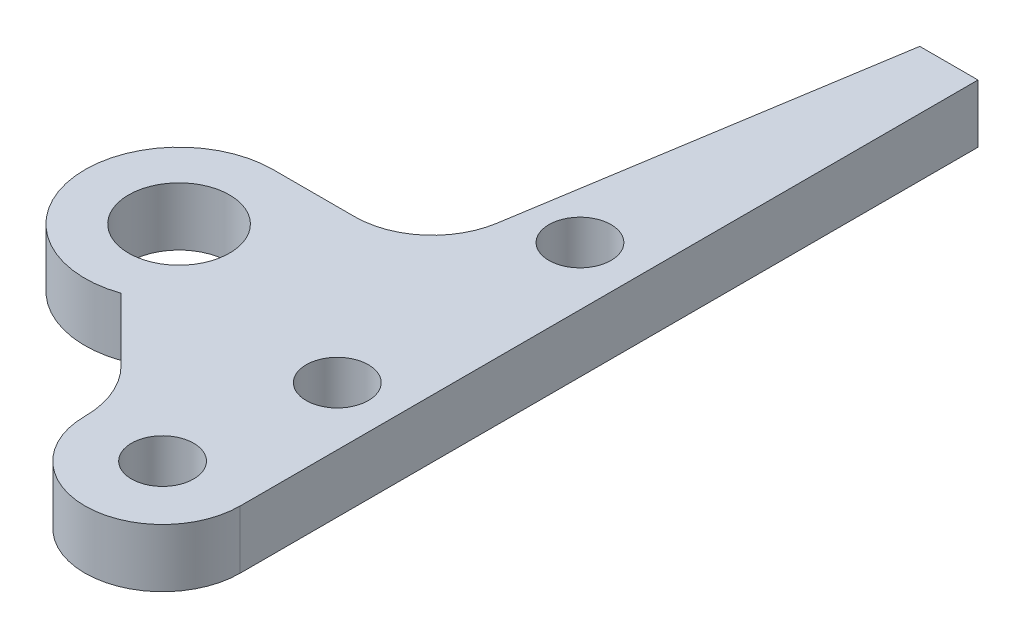
ISO-10303-21;
HEADER;
FILE_DESCRIPTION(('STEP AP214'),'2;1');
FILE_NAME('part.step','',(''),(''),'','','');
FILE_SCHEMA(('AUTOMOTIVE_DESIGN { 1 0 10303 214 1 1 1 1 }'));
ENDSEC;
DATA;
#1=APPLICATION_CONTEXT('core data for automotive mechanical design processes');
#2=APPLICATION_PROTOCOL_DEFINITION('international standard','automotive_design',2000,#1);
#3=PRODUCT_CONTEXT('',#1,'mechanical');
#4=PRODUCT('Part','Part','',(#3));
#5=PRODUCT_RELATED_PRODUCT_CATEGORY('part','',(#4));
#6=PRODUCT_DEFINITION_FORMATION('','',#4);
#7=PRODUCT_DEFINITION_CONTEXT('part definition',#1,'design');
#8=PRODUCT_DEFINITION('design','',#6,#7);
#9=PRODUCT_DEFINITION_SHAPE('','',#8);
#10=(LENGTH_UNIT() NAMED_UNIT(*) SI_UNIT(.MILLI.,.METRE.));
#11=(NAMED_UNIT(*) PLANE_ANGLE_UNIT() SI_UNIT($,.RADIAN.));
#12=(NAMED_UNIT(*) SI_UNIT($,.STERADIAN.) SOLID_ANGLE_UNIT());
#13=UNCERTAINTY_MEASURE_WITH_UNIT(LENGTH_MEASURE(1.E-05),#10,'distance_accuracy_value','');
#14=(GEOMETRIC_REPRESENTATION_CONTEXT(3) GLOBAL_UNCERTAINTY_ASSIGNED_CONTEXT((#13)) GLOBAL_UNIT_ASSIGNED_CONTEXT((#10,
#11,#12)) REPRESENTATION_CONTEXT('',''));
#15=CARTESIAN_POINT('',(0.,0.,0.));
#16=DIRECTION('',(0.,0.,1.));
#17=DIRECTION('',(1.,0.,0.));
#18=AXIS2_PLACEMENT_3D('',#15,#16,#17);
#19=CARTESIAN_POINT('',(0.,0.,0.));
#20=DIRECTION('',(0.,1.,0.));
#21=DIRECTION('',(1.,0.,0.));
#22=AXIS2_PLACEMENT_3D('',#19,#20,#21);
#23=PLANE('',#22);
#24=DIRECTION('',(-0.157736652180697,0.,0.98748121428148));
#25=VECTOR('',#24,1.);
#26=CARTESIAN_POINT('',(11.15,0.,-27.));
#27=LINE('',#26,#25);
#28=CARTESIAN_POINT('',(11.15,0.,-27.));
#29=VERTEX_POINT('',#28);
#30=CARTESIAN_POINT('',(8.15,0.,-8.219053391277));
#31=VERTEX_POINT('',#30);
#32=EDGE_CURVE('E111',#29,#31,#27,.T.);
#33=ORIENTED_EDGE('',*,*,#32,.F.);
#34=DIRECTION('',(-1.,0.,0.));
#35=VECTOR('',#34,1.);
#36=CARTESIAN_POINT('',(14.15,0.,-27.));
#37=LINE('',#36,#35);
#38=CARTESIAN_POINT('',(14.15,0.,-27.));
#39=VERTEX_POINT('',#38);
#40=EDGE_CURVE('E36',#39,#29,#37,.T.);
#41=ORIENTED_EDGE('',*,*,#40,.F.);
#42=DIRECTION('',(0.,0.,-1.));
#43=VECTOR('',#42,1.);
#44=CARTESIAN_POINT('',(14.15,0.,11.));
#45=LINE('',#44,#43);
#46=CARTESIAN_POINT('',(14.15,0.,11.));
#47=VERTEX_POINT('',#46);
#48=EDGE_CURVE('E125',#47,#39,#45,.T.);
#49=ORIENTED_EDGE('',*,*,#48,.F.);
#50=CARTESIAN_POINT('',(10.15,0.,11.));
#51=DIRECTION('',(0.,1.,0.));
#52=DIRECTION('',(-1.,0.,0.));
#53=AXIS2_PLACEMENT_3D('',#50,#51,#52);
#54=CIRCLE('',#53,4.);
#55=CARTESIAN_POINT('',(6.15,0.,11.));
#56=VERTEX_POINT('',#55);
#57=EDGE_CURVE('E129',#56,#47,#54,.T.);
#58=ORIENTED_EDGE('',*,*,#57,.F.);
#59=CARTESIAN_POINT('',(1.65,0.,11.));
#60=DIRECTION('',(0.,-1.,0.));
#61=DIRECTION('',(0.707106781186548,0.,-0.707106781186548));
#62=AXIS2_PLACEMENT_3D('',#59,#60,#61);
#63=CIRCLE('',#62,4.5);
#64=CARTESIAN_POINT('',(4.831980515339,0.,7.818019484661));
#65=VERTEX_POINT('',#64);
#66=EDGE_CURVE('E133',#65,#56,#63,.T.);
#67=ORIENTED_EDGE('',*,*,#66,.F.);
#68=DIRECTION('',(0.707106781186548,0.,0.707106781186548));
#69=VECTOR('',#68,1.);
#70=CARTESIAN_POINT('',(1.594397367406,0.,4.580436336727));
#71=LINE('',#70,#69);
#72=CARTESIAN_POINT('',(1.594397367406,0.,4.580436336727));
#73=VERTEX_POINT('',#72);
#74=EDGE_CURVE('E136',#73,#65,#71,.T.);
#75=ORIENTED_EDGE('',*,*,#74,.F.);
#76=CARTESIAN_POINT('',(0.,0.,0.));
#77=DIRECTION('',(0.,1.,0.));
#78=DIRECTION('',(0.,0.,-1.));
#79=AXIS2_PLACEMENT_3D('',#76,#77,#78);
#80=CIRCLE('',#79,4.85);
#81=CARTESIAN_POINT('',(0.,0.,-4.85));
#82=VERTEX_POINT('',#81);
#83=EDGE_CURVE('E139',#82,#73,#80,.T.);
#84=ORIENTED_EDGE('',*,*,#83,.F.);
#85=DIRECTION('',(-1.,0.,0.));
#86=VECTOR('',#85,1.);
#87=CARTESIAN_POINT('',(4.200075142874,0.,-4.85));
#88=LINE('',#87,#86);
#89=CARTESIAN_POINT('',(4.200075142874,0.,-4.85));
#90=VERTEX_POINT('',#89);
#91=EDGE_CURVE('E148',#90,#82,#88,.T.);
#92=ORIENTED_EDGE('',*,*,#91,.F.);
#93=CARTESIAN_POINT('',(4.200075142874,0.,-8.85));
#94=DIRECTION('',(0.,-1.,0.));
#95=DIRECTION('',(0.98748121428148,0.,0.157736652180697));
#96=AXIS2_PLACEMENT_3D('',#93,#94,#95);
#97=CIRCLE('',#96,4.);
#98=EDGE_CURVE('E113',#31,#90,#97,.T.);
#99=ORIENTED_EDGE('',*,*,#98,.F.);
#100=EDGE_LOOP('',(#33,#41,#49,#58,#67,#75,#84,#92,#99));
#101=FACE_BOUND('',#100,.T.);
#102=CARTESIAN_POINT('',(10.15,0.,11.));
#103=DIRECTION('',(0.,-1.,0.));
#104=DIRECTION('',(-1.,0.,0.));
#105=AXIS2_PLACEMENT_3D('',#102,#103,#104);
#106=CIRCLE('',#105,1.6);
#107=CARTESIAN_POINT('',(8.55,0.,11.));
#108=VERTEX_POINT('',#107);
#109=EDGE_CURVE('E11',#108,#108,#106,.T.);
#110=ORIENTED_EDGE('',*,*,#109,.F.);
#111=EDGE_LOOP('',(#110));
#112=FACE_BOUND('',#111,.T.);
#113=CARTESIAN_POINT('',(0.,0.,0.));
#114=DIRECTION('',(0.,-1.,0.));
#115=DIRECTION('',(-1.,0.,0.));
#116=AXIS2_PLACEMENT_3D('',#113,#114,#115);
#117=CIRCLE('',#116,2.6);
#118=CARTESIAN_POINT('',(-2.6,0.,0.));
#119=VERTEX_POINT('',#118);
#120=EDGE_CURVE('E151',#119,#119,#117,.T.);
#121=ORIENTED_EDGE('',*,*,#120,.F.);
#122=EDGE_LOOP('',(#121));
#123=FACE_BOUND('',#122,.T.);
#124=CARTESIAN_POINT('',(11.15,0.,3.));
#125=DIRECTION('',(0.,-1.,0.));
#126=DIRECTION('',(-1.,0.,0.));
#127=AXIS2_PLACEMENT_3D('',#124,#125,#126);
#128=CIRCLE('',#127,1.6);
#129=CARTESIAN_POINT('',(9.55,0.,3.));
#130=VERTEX_POINT('',#129);
#131=EDGE_CURVE('E155',#130,#130,#128,.T.);
#132=ORIENTED_EDGE('',*,*,#131,.F.);
#133=EDGE_LOOP('',(#132));
#134=FACE_BOUND('',#133,.T.);
#135=CARTESIAN_POINT('',(11.15,0.,-9.5));
#136=DIRECTION('',(0.,-1.,0.));
#137=DIRECTION('',(-1.,0.,0.));
#138=AXIS2_PLACEMENT_3D('',#135,#136,#137);
#139=CIRCLE('',#138,1.6);
#140=CARTESIAN_POINT('',(9.55,0.,-9.5));
#141=VERTEX_POINT('',#140);
#142=EDGE_CURVE('E158',#141,#141,#139,.T.);
#143=ORIENTED_EDGE('',*,*,#142,.F.);
#144=EDGE_LOOP('',(#143));
#145=FACE_BOUND('',#144,.T.);
#146=ADVANCED_FACE('F17',(#101,#112,#123,#134,#145),#23,.F.);
#147=CARTESIAN_POINT('',(10.15,0.,11.));
#148=DIRECTION('',(0.,1.,0.));
#149=DIRECTION('',(1.,0.,0.));
#150=AXIS2_PLACEMENT_3D('',#147,#148,#149);
#151=CYLINDRICAL_SURFACE('',#150,1.6);
#152=CARTESIAN_POINT('',(10.15,3.,11.));
#153=DIRECTION('',(0.,-1.,0.));
#154=DIRECTION('',(1.,0.,0.));
#155=AXIS2_PLACEMENT_3D('',#152,#153,#154);
#156=CIRCLE('',#155,1.6);
#157=CARTESIAN_POINT('',(11.75,3.,11.));
#158=VERTEX_POINT('',#157);
#159=EDGE_CURVE('E103',#158,#158,#156,.T.);
#160=ORIENTED_EDGE('',*,*,#159,.F.);
#161=EDGE_LOOP('',(#160));
#162=FACE_BOUND('',#161,.T.);
#163=ORIENTED_EDGE('',*,*,#109,.T.);
#164=EDGE_LOOP('',(#163));
#165=FACE_BOUND('',#164,.T.);
#166=ADVANCED_FACE('F199',(#162,#165),#151,.F.);
#167=CARTESIAN_POINT('',(0.,3.,0.));
#168=DIRECTION('',(0.,1.,0.));
#169=DIRECTION('',(1.,0.,0.));
#170=AXIS2_PLACEMENT_3D('',#167,#168,#169);
#171=PLANE('',#170);
#172=DIRECTION('',(-1.,0.,0.));
#173=VECTOR('',#172,1.);
#174=CARTESIAN_POINT('',(4.200075142874,3.,-4.85));
#175=LINE('',#174,#173);
#176=CARTESIAN_POINT('',(4.200075142874,3.,-4.85));
#177=VERTEX_POINT('',#176);
#178=CARTESIAN_POINT('',(0.,3.,-4.85));
#179=VERTEX_POINT('',#178);
#180=EDGE_CURVE('E27',#177,#179,#175,.T.);
#181=ORIENTED_EDGE('',*,*,#180,.T.);
#182=CARTESIAN_POINT('',(0.,3.,0.));
#183=DIRECTION('',(0.,1.,0.));
#184=DIRECTION('',(0.,0.,-1.));
#185=AXIS2_PLACEMENT_3D('',#182,#183,#184);
#186=CIRCLE('',#185,4.85);
#187=CARTESIAN_POINT('',(1.594397367406,3.,4.580436336727));
#188=VERTEX_POINT('',#187);
#189=EDGE_CURVE('E165',#179,#188,#186,.T.);
#190=ORIENTED_EDGE('',*,*,#189,.T.);
#191=DIRECTION('',(0.707106781186548,0.,0.707106781186548));
#192=VECTOR('',#191,1.);
#193=CARTESIAN_POINT('',(1.594397367406,3.,4.580436336727));
#194=LINE('',#193,#192);
#195=CARTESIAN_POINT('',(4.831980515339,3.,7.818019484661));
#196=VERTEX_POINT('',#195);
#197=EDGE_CURVE('E168',#188,#196,#194,.T.);
#198=ORIENTED_EDGE('',*,*,#197,.T.);
#199=CARTESIAN_POINT('',(1.65,3.,11.));
#200=DIRECTION('',(0.,-1.,0.));
#201=DIRECTION('',(0.707106781186548,0.,-0.707106781186548));
#202=AXIS2_PLACEMENT_3D('',#199,#200,#201);
#203=CIRCLE('',#202,4.5);
#204=CARTESIAN_POINT('',(6.15,3.,11.));
#205=VERTEX_POINT('',#204);
#206=EDGE_CURVE('E171',#196,#205,#203,.T.);
#207=ORIENTED_EDGE('',*,*,#206,.T.);
#208=CARTESIAN_POINT('',(10.15,3.,11.));
#209=DIRECTION('',(0.,1.,0.));
#210=DIRECTION('',(-1.,0.,0.));
#211=AXIS2_PLACEMENT_3D('',#208,#209,#210);
#212=CIRCLE('',#211,4.);
#213=CARTESIAN_POINT('',(14.15,3.,11.));
#214=VERTEX_POINT('',#213);
#215=EDGE_CURVE('E174',#205,#214,#212,.T.);
#216=ORIENTED_EDGE('',*,*,#215,.T.);
#217=DIRECTION('',(0.,0.,-1.));
#218=VECTOR('',#217,1.);
#219=CARTESIAN_POINT('',(14.15,3.,11.));
#220=LINE('',#219,#218);
#221=CARTESIAN_POINT('',(14.15,3.,-27.));
#222=VERTEX_POINT('',#221);
#223=EDGE_CURVE('E177',#214,#222,#220,.T.);
#224=ORIENTED_EDGE('',*,*,#223,.T.);
#225=DIRECTION('',(-1.,0.,0.));
#226=VECTOR('',#225,1.);
#227=CARTESIAN_POINT('',(14.15,3.,-27.));
#228=LINE('',#227,#226);
#229=CARTESIAN_POINT('',(11.15,3.,-27.));
#230=VERTEX_POINT('',#229);
#231=EDGE_CURVE('E108',#222,#230,#228,.T.);
#232=ORIENTED_EDGE('',*,*,#231,.T.);
#233=DIRECTION('',(-0.157736652180697,0.,0.98748121428148));
#234=VECTOR('',#233,1.);
#235=CARTESIAN_POINT('',(11.15,3.,-27.));
#236=LINE('',#235,#234);
#237=CARTESIAN_POINT('',(8.15,3.,-8.219053391277));
#238=VERTEX_POINT('',#237);
#239=EDGE_CURVE('E88',#230,#238,#236,.T.);
#240=ORIENTED_EDGE('',*,*,#239,.T.);
#241=CARTESIAN_POINT('',(4.200075142874,3.,-8.85));
#242=DIRECTION('',(0.,-1.,0.));
#243=DIRECTION('',(0.98748121428148,0.,0.157736652180697));
#244=AXIS2_PLACEMENT_3D('',#241,#242,#243);
#245=CIRCLE('',#244,4.);
#246=EDGE_CURVE('E94',#238,#177,#245,.T.);
#247=ORIENTED_EDGE('',*,*,#246,.T.);
#248=EDGE_LOOP('',(#181,#190,#198,#207,#216,#224,#232,#240,#247));
#249=FACE_BOUND('',#248,.T.);
#250=ORIENTED_EDGE('',*,*,#159,.T.);
#251=EDGE_LOOP('',(#250));
#252=FACE_BOUND('',#251,.T.);
#253=CARTESIAN_POINT('',(0.,3.,0.));
#254=DIRECTION('',(0.,-1.,0.));
#255=DIRECTION('',(-1.,0.,0.));
#256=AXIS2_PLACEMENT_3D('',#253,#254,#255);
#257=CIRCLE('',#256,2.6);
#258=CARTESIAN_POINT('',(-2.6,3.,0.));
#259=VERTEX_POINT('',#258);
#260=EDGE_CURVE('E163',#259,#259,#257,.T.);
#261=ORIENTED_EDGE('',*,*,#260,.T.);
#262=EDGE_LOOP('',(#261));
#263=FACE_BOUND('',#262,.T.);
#264=CARTESIAN_POINT('',(11.15,3.,3.));
#265=DIRECTION('',(0.,-1.,0.));
#266=DIRECTION('',(-1.,0.,0.));
#267=AXIS2_PLACEMENT_3D('',#264,#265,#266);
#268=CIRCLE('',#267,1.6);
#269=CARTESIAN_POINT('',(9.55,3.,3.));
#270=VERTEX_POINT('',#269);
#271=EDGE_CURVE('E182',#270,#270,#268,.T.);
#272=ORIENTED_EDGE('',*,*,#271,.T.);
#273=EDGE_LOOP('',(#272));
#274=FACE_BOUND('',#273,.T.);
#275=CARTESIAN_POINT('',(11.15,3.,-9.5));
#276=DIRECTION('',(0.,-1.,0.));
#277=DIRECTION('',(-1.,0.,0.));
#278=AXIS2_PLACEMENT_3D('',#275,#276,#277);
#279=CIRCLE('',#278,1.6);
#280=CARTESIAN_POINT('',(9.55,3.,-9.5));
#281=VERTEX_POINT('',#280);
#282=EDGE_CURVE('E184',#281,#281,#279,.T.);
#283=ORIENTED_EDGE('',*,*,#282,.T.);
#284=EDGE_LOOP('',(#283));
#285=FACE_BOUND('',#284,.T.);
#286=ADVANCED_FACE('F105',(#249,#252,#263,#274,#285),#171,.T.);
#287=CARTESIAN_POINT('',(4.200075142874,0.,-8.85));
#288=DIRECTION('',(0.,1.,0.));
#289=DIRECTION('',(1.,0.,0.));
#290=AXIS2_PLACEMENT_3D('',#287,#288,#289);
#291=CYLINDRICAL_SURFACE('',#290,4.);
#292=DIRECTION('',(0.,1.,0.));
#293=VECTOR('',#292,1.);
#294=CARTESIAN_POINT('',(4.200075142874,0.,-4.85));
#295=LINE('',#294,#293);
#296=EDGE_CURVE('E99',#90,#177,#295,.T.);
#297=ORIENTED_EDGE('',*,*,#296,.T.);
#298=ORIENTED_EDGE('',*,*,#246,.F.);
#299=DIRECTION('',(0.,1.,0.));
#300=VECTOR('',#299,1.);
#301=CARTESIAN_POINT('',(8.15,0.,-8.219053391277));
#302=LINE('',#301,#300);
#303=EDGE_CURVE('E97',#31,#238,#302,.T.);
#304=ORIENTED_EDGE('',*,*,#303,.F.);
#305=ORIENTED_EDGE('',*,*,#98,.T.);
#306=EDGE_LOOP('',(#297,#298,#304,#305));
#307=FACE_BOUND('',#306,.T.);
#308=ADVANCED_FACE('F95',(#307),#291,.F.);
#309=CARTESIAN_POINT('',(11.15,0.,-27.));
#310=DIRECTION('',(-0.98748121428148,0.,-0.157736652180697));
#311=DIRECTION('',(-0.157736652180697,0.,0.98748121428148));
#312=AXIS2_PLACEMENT_3D('',#309,#310,#311);
#313=PLANE('',#312);
#314=ORIENTED_EDGE('',*,*,#303,.T.);
#315=ORIENTED_EDGE('',*,*,#239,.F.);
#316=DIRECTION('',(0.,1.,0.));
#317=VECTOR('',#316,1.);
#318=CARTESIAN_POINT('',(11.15,0.,-27.));
#319=LINE('',#318,#317);
#320=EDGE_CURVE('E116',#29,#230,#319,.T.);
#321=ORIENTED_EDGE('',*,*,#320,.F.);
#322=ORIENTED_EDGE('',*,*,#32,.T.);
#323=EDGE_LOOP('',(#314,#315,#321,#322));
#324=FACE_BOUND('',#323,.T.);
#325=ADVANCED_FACE('F110',(#324),#313,.T.);
#326=CARTESIAN_POINT('',(14.15,0.,-27.));
#327=DIRECTION('',(0.,0.,-1.));
#328=DIRECTION('',(-1.,0.,0.));
#329=AXIS2_PLACEMENT_3D('',#326,#327,#328);
#330=PLANE('',#329);
#331=ORIENTED_EDGE('',*,*,#320,.T.);
#332=ORIENTED_EDGE('',*,*,#231,.F.);
#333=DIRECTION('',(0.,1.,0.));
#334=VECTOR('',#333,1.);
#335=CARTESIAN_POINT('',(14.15,0.,-27.));
#336=LINE('',#335,#334);
#337=EDGE_CURVE('E122',#39,#222,#336,.T.);
#338=ORIENTED_EDGE('',*,*,#337,.F.);
#339=ORIENTED_EDGE('',*,*,#40,.T.);
#340=EDGE_LOOP('',(#331,#332,#338,#339));
#341=FACE_BOUND('',#340,.T.);
#342=ADVANCED_FACE('F215',(#341),#330,.T.);
#343=CARTESIAN_POINT('',(14.15,0.,11.));
#344=DIRECTION('',(1.,0.,0.));
#345=DIRECTION('',(0.,0.,-1.));
#346=AXIS2_PLACEMENT_3D('',#343,#344,#345);
#347=PLANE('',#346);
#348=ORIENTED_EDGE('',*,*,#337,.T.);
#349=ORIENTED_EDGE('',*,*,#223,.F.);
#350=DIRECTION('',(0.,1.,0.));
#351=VECTOR('',#350,1.);
#352=CARTESIAN_POINT('',(14.15,0.,11.));
#353=LINE('',#352,#351);
#354=EDGE_CURVE('E126',#47,#214,#353,.T.);
#355=ORIENTED_EDGE('',*,*,#354,.F.);
#356=ORIENTED_EDGE('',*,*,#48,.T.);
#357=EDGE_LOOP('',(#348,#349,#355,#356));
#358=FACE_BOUND('',#357,.T.);
#359=ADVANCED_FACE('F218',(#358),#347,.T.);
#360=CARTESIAN_POINT('',(10.15,0.,11.));
#361=DIRECTION('',(0.,1.,0.));
#362=DIRECTION('',(1.,0.,0.));
#363=AXIS2_PLACEMENT_3D('',#360,#361,#362);
#364=CYLINDRICAL_SURFACE('',#363,4.);
#365=ORIENTED_EDGE('',*,*,#354,.T.);
#366=ORIENTED_EDGE('',*,*,#215,.F.);
#367=DIRECTION('',(0.,1.,0.));
#368=VECTOR('',#367,1.);
#369=CARTESIAN_POINT('',(6.15,0.,11.));
#370=LINE('',#369,#368);
#371=EDGE_CURVE('E130',#56,#205,#370,.T.);
#372=ORIENTED_EDGE('',*,*,#371,.F.);
#373=ORIENTED_EDGE('',*,*,#57,.T.);
#374=EDGE_LOOP('',(#365,#366,#372,#373));
#375=FACE_BOUND('',#374,.T.);
#376=ADVANCED_FACE('F221',(#375),#364,.T.);
#377=CARTESIAN_POINT('',(1.65,0.,11.));
#378=DIRECTION('',(0.,1.,0.));
#379=DIRECTION('',(1.,0.,0.));
#380=AXIS2_PLACEMENT_3D('',#377,#378,#379);
#381=CYLINDRICAL_SURFACE('',#380,4.5);
#382=ORIENTED_EDGE('',*,*,#371,.T.);
#383=ORIENTED_EDGE('',*,*,#206,.F.);
#384=DIRECTION('',(0.,1.,0.));
#385=VECTOR('',#384,1.);
#386=CARTESIAN_POINT('',(4.831980515339,0.,7.818019484661));
#387=LINE('',#386,#385);
#388=EDGE_CURVE('E134',#65,#196,#387,.T.);
#389=ORIENTED_EDGE('',*,*,#388,.F.);
#390=ORIENTED_EDGE('',*,*,#66,.T.);
#391=EDGE_LOOP('',(#382,#383,#389,#390));
#392=FACE_BOUND('',#391,.T.);
#393=ADVANCED_FACE('F225',(#392),#381,.F.);
#394=CARTESIAN_POINT('',(1.594397367406,0.,4.580436336727));
#395=DIRECTION('',(-0.707106781186548,0.,0.707106781186548));
#396=DIRECTION('',(0.707106781186548,0.,0.707106781186548));
#397=AXIS2_PLACEMENT_3D('',#394,#395,#396);
#398=PLANE('',#397);
#399=ORIENTED_EDGE('',*,*,#388,.T.);
#400=ORIENTED_EDGE('',*,*,#197,.F.);
#401=DIRECTION('',(0.,1.,0.));
#402=VECTOR('',#401,1.);
#403=CARTESIAN_POINT('',(1.594397367406,0.,4.580436336727));
#404=LINE('',#403,#402);
#405=EDGE_CURVE('E137',#73,#188,#404,.T.);
#406=ORIENTED_EDGE('',*,*,#405,.F.);
#407=ORIENTED_EDGE('',*,*,#74,.T.);
#408=EDGE_LOOP('',(#399,#400,#406,#407));
#409=FACE_BOUND('',#408,.T.);
#410=ADVANCED_FACE('F229',(#409),#398,.T.);
#411=CARTESIAN_POINT('',(0.,0.,0.));
#412=DIRECTION('',(0.,1.,0.));
#413=DIRECTION('',(1.,0.,0.));
#414=AXIS2_PLACEMENT_3D('',#411,#412,#413);
#415=CYLINDRICAL_SURFACE('',#414,4.85);
#416=ORIENTED_EDGE('',*,*,#405,.T.);
#417=ORIENTED_EDGE('',*,*,#189,.F.);
#418=DIRECTION('',(0.,1.,0.));
#419=VECTOR('',#418,1.);
#420=CARTESIAN_POINT('',(0.,0.,-4.85));
#421=LINE('',#420,#419);
#422=EDGE_CURVE('E21',#82,#179,#421,.T.);
#423=ORIENTED_EDGE('',*,*,#422,.F.);
#424=ORIENTED_EDGE('',*,*,#83,.T.);
#425=EDGE_LOOP('',(#416,#417,#423,#424));
#426=FACE_BOUND('',#425,.T.);
#427=ADVANCED_FACE('F233',(#426),#415,.T.);
#428=CARTESIAN_POINT('',(4.200075142874,0.,-4.85));
#429=DIRECTION('',(0.,0.,-1.));
#430=DIRECTION('',(-1.,0.,0.));
#431=AXIS2_PLACEMENT_3D('',#428,#429,#430);
#432=PLANE('',#431);
#433=ORIENTED_EDGE('',*,*,#422,.T.);
#434=ORIENTED_EDGE('',*,*,#180,.F.);
#435=ORIENTED_EDGE('',*,*,#296,.F.);
#436=ORIENTED_EDGE('',*,*,#91,.T.);
#437=EDGE_LOOP('',(#433,#434,#435,#436));
#438=FACE_BOUND('',#437,.T.);
#439=ADVANCED_FACE('F237',(#438),#432,.T.);
#440=CARTESIAN_POINT('',(0.,3.,0.));
#441=DIRECTION('',(0.,-1.,0.));
#442=DIRECTION('',(1.,0.,0.));
#443=AXIS2_PLACEMENT_3D('',#440,#441,#442);
#444=CYLINDRICAL_SURFACE('',#443,2.6);
#445=ORIENTED_EDGE('',*,*,#120,.T.);
#446=EDGE_LOOP('',(#445));
#447=FACE_BOUND('',#446,.T.);
#448=ORIENTED_EDGE('',*,*,#260,.F.);
#449=EDGE_LOOP('',(#448));
#450=FACE_BOUND('',#449,.T.);
#451=ADVANCED_FACE('F196',(#447,#450),#444,.F.);
#452=CARTESIAN_POINT('',(11.15,3.,3.));
#453=DIRECTION('',(0.,-1.,0.));
#454=DIRECTION('',(1.,0.,0.));
#455=AXIS2_PLACEMENT_3D('',#452,#453,#454);
#456=CYLINDRICAL_SURFACE('',#455,1.6);
#457=ORIENTED_EDGE('',*,*,#131,.T.);
#458=EDGE_LOOP('',(#457));
#459=FACE_BOUND('',#458,.T.);
#460=ORIENTED_EDGE('',*,*,#271,.F.);
#461=EDGE_LOOP('',(#460));
#462=FACE_BOUND('',#461,.T.);
#463=ADVANCED_FACE('F190',(#459,#462),#456,.F.);
#464=CARTESIAN_POINT('',(11.15,3.,-9.5));
#465=DIRECTION('',(0.,-1.,0.));
#466=DIRECTION('',(1.,0.,0.));
#467=AXIS2_PLACEMENT_3D('',#464,#465,#466);
#468=CYLINDRICAL_SURFACE('',#467,1.6);
#469=ORIENTED_EDGE('',*,*,#142,.T.);
#470=EDGE_LOOP('',(#469));
#471=FACE_BOUND('',#470,.T.);
#472=ORIENTED_EDGE('',*,*,#282,.F.);
#473=EDGE_LOOP('',(#472));
#474=FACE_BOUND('',#473,.T.);
#475=ADVANCED_FACE('F19',(#471,#474),#468,.F.);
#476=CLOSED_SHELL('',(#146,#166,#286,#308,#325,#342,#359,#376,#393,#410,#427,#439,#451,#463,#475));
#477=MANIFOLD_SOLID_BREP('B1',#476);
#478=ADVANCED_BREP_SHAPE_REPRESENTATION('',(#18,#477),#14);
#479=SHAPE_DEFINITION_REPRESENTATION(#9,#478);
ENDSEC;
END-ISO-10303-21;
